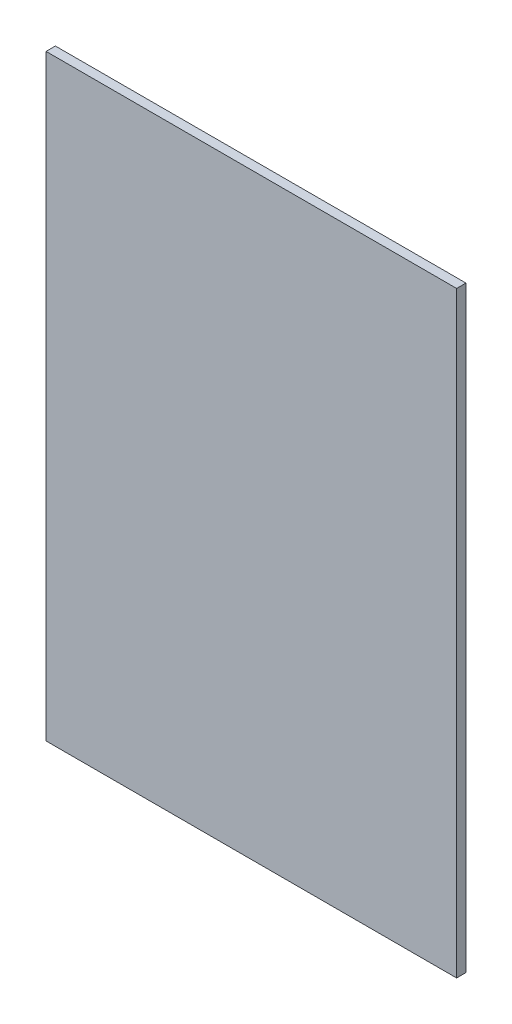
ISO-10303-21;
HEADER;
FILE_DESCRIPTION(('STEP AP214'),'2;1');
FILE_NAME('part.step','',(''),(''),'','','');
FILE_SCHEMA(('AUTOMOTIVE_DESIGN { 1 0 10303 214 1 1 1 1 }'));
ENDSEC;
DATA;
#1=APPLICATION_CONTEXT('core data for automotive mechanical design processes');
#2=APPLICATION_PROTOCOL_DEFINITION('international standard','automotive_design',2000,#1);
#3=PRODUCT_CONTEXT('',#1,'mechanical');
#4=PRODUCT('Part','Part','',(#3));
#5=PRODUCT_RELATED_PRODUCT_CATEGORY('part','',(#4));
#6=PRODUCT_DEFINITION_FORMATION('','',#4);
#7=PRODUCT_DEFINITION_CONTEXT('part definition',#1,'design');
#8=PRODUCT_DEFINITION('design','',#6,#7);
#9=PRODUCT_DEFINITION_SHAPE('','',#8);
#10=(LENGTH_UNIT() NAMED_UNIT(*) SI_UNIT(.MILLI.,.METRE.));
#11=(NAMED_UNIT(*) PLANE_ANGLE_UNIT() SI_UNIT($,.RADIAN.));
#12=(NAMED_UNIT(*) SI_UNIT($,.STERADIAN.) SOLID_ANGLE_UNIT());
#13=UNCERTAINTY_MEASURE_WITH_UNIT(LENGTH_MEASURE(1.E-05),#10,'distance_accuracy_value','');
#14=(GEOMETRIC_REPRESENTATION_CONTEXT(3) GLOBAL_UNCERTAINTY_ASSIGNED_CONTEXT((#13)) GLOBAL_UNIT_ASSIGNED_CONTEXT((#10,
#11,#12)) REPRESENTATION_CONTEXT('',''));
#15=CARTESIAN_POINT('',(0.,0.,0.));
#16=DIRECTION('',(0.,0.,1.));
#17=DIRECTION('',(1.,0.,0.));
#18=AXIS2_PLACEMENT_3D('',#15,#16,#17);
#19=CARTESIAN_POINT('',(0.,0.,0.));
#20=DIRECTION('',(0.,0.,1.));
#21=DIRECTION('',(1.,0.,0.));
#22=AXIS2_PLACEMENT_3D('',#19,#20,#21);
#23=PLANE('',#22);
#24=DIRECTION('',(1.,0.,0.));
#25=VECTOR('',#24,1.);
#26=CARTESIAN_POINT('',(2.2,3.2,0.));
#27=LINE('',#26,#25);
#28=CARTESIAN_POINT('',(2.2,3.2,0.));
#29=VERTEX_POINT('',#28);
#30=CARTESIAN_POINT('',(-2.2,3.2,0.));
#31=VERTEX_POINT('',#30);
#32=EDGE_CURVE('E79',#29,#31,#27,.F.);
#33=ORIENTED_EDGE('',*,*,#32,.F.);
#34=DIRECTION('',(0.,1.,0.));
#35=VECTOR('',#34,1.);
#36=CARTESIAN_POINT('',(2.2,-3.2,0.));
#37=LINE('',#36,#35);
#38=CARTESIAN_POINT('',(2.2,-3.2,0.));
#39=VERTEX_POINT('',#38);
#40=EDGE_CURVE('E55',#39,#29,#37,.T.);
#41=ORIENTED_EDGE('',*,*,#40,.F.);
#42=DIRECTION('',(1.,0.,0.));
#43=VECTOR('',#42,1.);
#44=CARTESIAN_POINT('',(-2.2,-3.2,0.));
#45=LINE('',#44,#43);
#46=CARTESIAN_POINT('',(-2.2,-3.2,0.));
#47=VERTEX_POINT('',#46);
#48=EDGE_CURVE('E57',#47,#39,#45,.T.);
#49=ORIENTED_EDGE('',*,*,#48,.F.);
#50=DIRECTION('',(0.,1.,0.));
#51=VECTOR('',#50,1.);
#52=CARTESIAN_POINT('',(-2.2,3.2,0.));
#53=LINE('',#52,#51);
#54=EDGE_CURVE('E20',#31,#47,#53,.F.);
#55=ORIENTED_EDGE('',*,*,#54,.F.);
#56=EDGE_LOOP('',(#33,#41,#49,#55));
#57=FACE_BOUND('',#56,.T.);
#58=ADVANCED_FACE('F17',(#57),#23,.F.);
#59=CARTESIAN_POINT('',(-2.2,3.2,0.));
#60=DIRECTION('',(-1.,0.,0.));
#61=DIRECTION('',(0.,0.,1.));
#62=AXIS2_PLACEMENT_3D('',#59,#60,#61);
#63=PLANE('',#62);
#64=DIRECTION('',(0.,1.,0.));
#65=VECTOR('',#64,1.);
#66=CARTESIAN_POINT('',(-2.2,0.,0.1));
#67=LINE('',#66,#65);
#68=CARTESIAN_POINT('',(-2.2,3.2,0.1));
#69=VERTEX_POINT('',#68);
#70=CARTESIAN_POINT('',(-2.2,-3.2,0.1));
#71=VERTEX_POINT('',#70);
#72=EDGE_CURVE('E83',#69,#71,#67,.F.);
#73=ORIENTED_EDGE('',*,*,#72,.F.);
#74=DIRECTION('',(0.,0.,1.));
#75=VECTOR('',#74,1.);
#76=CARTESIAN_POINT('',(-2.2,3.2,0.));
#77=LINE('',#76,#75);
#78=EDGE_CURVE('E68',#31,#69,#77,.T.);
#79=ORIENTED_EDGE('',*,*,#78,.F.);
#80=ORIENTED_EDGE('',*,*,#54,.T.);
#81=DIRECTION('',(0.,0.,-1.));
#82=VECTOR('',#81,1.);
#83=CARTESIAN_POINT('',(-2.2,-3.2,0.));
#84=LINE('',#83,#82);
#85=EDGE_CURVE('E63',#71,#47,#84,.T.);
#86=ORIENTED_EDGE('',*,*,#85,.F.);
#87=EDGE_LOOP('',(#73,#79,#80,#86));
#88=FACE_BOUND('',#87,.T.);
#89=ADVANCED_FACE('F65',(#88),#63,.T.);
#90=CARTESIAN_POINT('',(-2.2,-3.2,0.));
#91=DIRECTION('',(0.,-1.,0.));
#92=DIRECTION('',(0.,0.,-1.));
#93=AXIS2_PLACEMENT_3D('',#90,#91,#92);
#94=PLANE('',#93);
#95=DIRECTION('',(1.,0.,0.));
#96=VECTOR('',#95,1.);
#97=CARTESIAN_POINT('',(0.,-3.2,0.1));
#98=LINE('',#97,#96);
#99=CARTESIAN_POINT('',(2.2,-3.2,0.1));
#100=VERTEX_POINT('',#99);
#101=EDGE_CURVE('E72',#71,#100,#98,.T.);
#102=ORIENTED_EDGE('',*,*,#101,.F.);
#103=ORIENTED_EDGE('',*,*,#85,.T.);
#104=ORIENTED_EDGE('',*,*,#48,.T.);
#105=DIRECTION('',(0.,0.,-1.));
#106=VECTOR('',#105,1.);
#107=CARTESIAN_POINT('',(2.2,-3.2,0.));
#108=LINE('',#107,#106);
#109=EDGE_CURVE('E75',#100,#39,#108,.T.);
#110=ORIENTED_EDGE('',*,*,#109,.F.);
#111=EDGE_LOOP('',(#102,#103,#104,#110));
#112=FACE_BOUND('',#111,.T.);
#113=ADVANCED_FACE('F70',(#112),#94,.T.);
#114=CARTESIAN_POINT('',(2.2,-3.2,0.));
#115=DIRECTION('',(1.,0.,0.));
#116=DIRECTION('',(0.,0.,-1.));
#117=AXIS2_PLACEMENT_3D('',#114,#115,#116);
#118=PLANE('',#117);
#119=DIRECTION('',(0.,1.,0.));
#120=VECTOR('',#119,1.);
#121=CARTESIAN_POINT('',(2.2,0.,0.1));
#122=LINE('',#121,#120);
#123=CARTESIAN_POINT('',(2.2,3.2,0.1));
#124=VERTEX_POINT('',#123);
#125=EDGE_CURVE('E26',#100,#124,#122,.T.);
#126=ORIENTED_EDGE('',*,*,#125,.F.);
#127=ORIENTED_EDGE('',*,*,#109,.T.);
#128=ORIENTED_EDGE('',*,*,#40,.T.);
#129=DIRECTION('',(0.,0.,1.));
#130=VECTOR('',#129,1.);
#131=CARTESIAN_POINT('',(2.2,3.2,0.));
#132=LINE('',#131,#130);
#133=EDGE_CURVE('E35',#124,#29,#132,.F.);
#134=ORIENTED_EDGE('',*,*,#133,.F.);
#135=EDGE_LOOP('',(#126,#127,#128,#134));
#136=FACE_BOUND('',#135,.T.);
#137=ADVANCED_FACE('F89',(#136),#118,.T.);
#138=CARTESIAN_POINT('',(2.2,3.2,0.));
#139=DIRECTION('',(0.,1.,0.));
#140=DIRECTION('',(0.,0.,1.));
#141=AXIS2_PLACEMENT_3D('',#138,#139,#140);
#142=PLANE('',#141);
#143=DIRECTION('',(1.,0.,0.));
#144=VECTOR('',#143,1.);
#145=CARTESIAN_POINT('',(0.,3.2,0.1));
#146=LINE('',#145,#144);
#147=EDGE_CURVE('E11',#124,#69,#146,.F.);
#148=ORIENTED_EDGE('',*,*,#147,.F.);
#149=ORIENTED_EDGE('',*,*,#133,.T.);
#150=ORIENTED_EDGE('',*,*,#32,.T.);
#151=ORIENTED_EDGE('',*,*,#78,.T.);
#152=EDGE_LOOP('',(#148,#149,#150,#151));
#153=FACE_BOUND('',#152,.T.);
#154=ADVANCED_FACE('F91',(#153),#142,.T.);
#155=CARTESIAN_POINT('',(0.,0.,0.1));
#156=DIRECTION('',(0.,0.,1.));
#157=DIRECTION('',(1.,0.,0.));
#158=AXIS2_PLACEMENT_3D('',#155,#156,#157);
#159=PLANE('',#158);
#160=ORIENTED_EDGE('',*,*,#125,.T.);
#161=ORIENTED_EDGE('',*,*,#147,.T.);
#162=ORIENTED_EDGE('',*,*,#72,.T.);
#163=ORIENTED_EDGE('',*,*,#101,.T.);
#164=EDGE_LOOP('',(#160,#161,#162,#163));
#165=FACE_BOUND('',#164,.T.);
#166=ADVANCED_FACE('F88',(#165),#159,.T.);
#167=CLOSED_SHELL('',(#58,#89,#113,#137,#154,#166));
#168=MANIFOLD_SOLID_BREP('B1',#167);
#169=ADVANCED_BREP_SHAPE_REPRESENTATION('',(#18,#168),#14);
#170=SHAPE_DEFINITION_REPRESENTATION(#9,#169);
ENDSEC;
END-ISO-10303-21;
